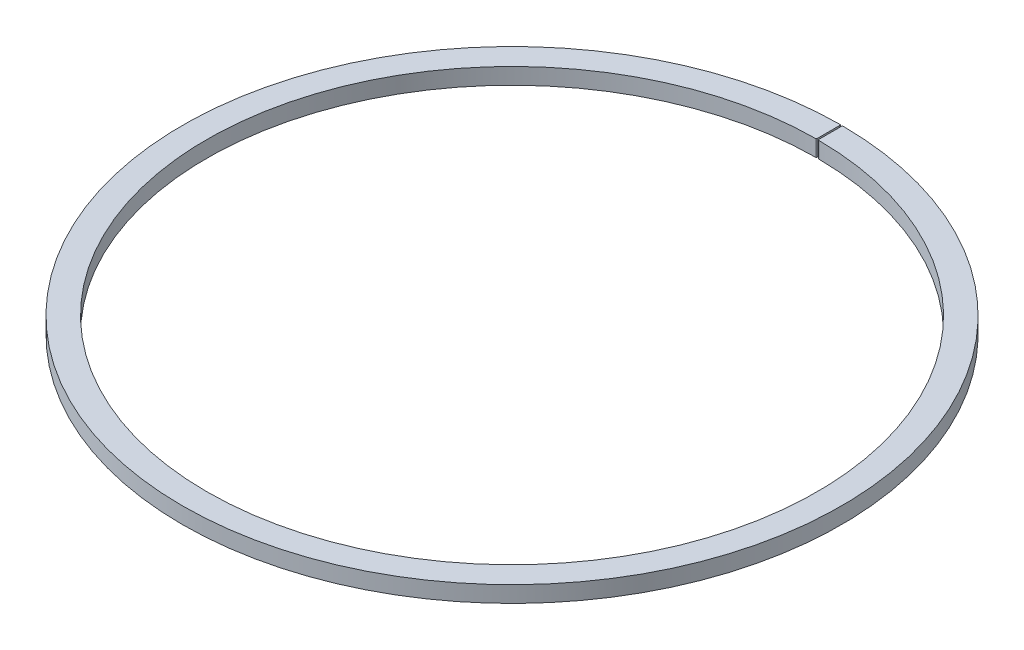
ISO-10303-21;
HEADER;
FILE_DESCRIPTION(('STEP AP214'),'2;1');
FILE_NAME('part.step','',(''),(''),'','','');
FILE_SCHEMA(('AUTOMOTIVE_DESIGN { 1 0 10303 214 1 1 1 1 }'));
ENDSEC;
DATA;
#1=APPLICATION_CONTEXT('core data for automotive mechanical design processes');
#2=APPLICATION_PROTOCOL_DEFINITION('international standard','automotive_design',2000,#1);
#3=PRODUCT_CONTEXT('',#1,'mechanical');
#4=PRODUCT('Part','Part','',(#3));
#5=PRODUCT_RELATED_PRODUCT_CATEGORY('part','',(#4));
#6=PRODUCT_DEFINITION_FORMATION('','',#4);
#7=PRODUCT_DEFINITION_CONTEXT('part definition',#1,'design');
#8=PRODUCT_DEFINITION('design','',#6,#7);
#9=PRODUCT_DEFINITION_SHAPE('','',#8);
#10=(LENGTH_UNIT() NAMED_UNIT(*) SI_UNIT(.MILLI.,.METRE.));
#11=(NAMED_UNIT(*) PLANE_ANGLE_UNIT() SI_UNIT($,.RADIAN.));
#12=(NAMED_UNIT(*) SI_UNIT($,.STERADIAN.) SOLID_ANGLE_UNIT());
#13=UNCERTAINTY_MEASURE_WITH_UNIT(LENGTH_MEASURE(1.E-05),#10,'distance_accuracy_value','');
#14=(GEOMETRIC_REPRESENTATION_CONTEXT(3) GLOBAL_UNCERTAINTY_ASSIGNED_CONTEXT((#13)) GLOBAL_UNIT_ASSIGNED_CONTEXT((#10,
#11,#12)) REPRESENTATION_CONTEXT('',''));
#15=CARTESIAN_POINT('',(0.,0.,0.));
#16=DIRECTION('',(0.,0.,1.));
#17=DIRECTION('',(1.,0.,0.));
#18=AXIS2_PLACEMENT_3D('',#15,#16,#17);
#19=CARTESIAN_POINT('',(-0.100000000000004,2.,0.));
#20=DIRECTION('',(1.,0.,0.));
#21=DIRECTION('',(0.,0.,-1.));
#22=AXIS2_PLACEMENT_3D('',#19,#20,#21);
#23=PLANE('',#22);
#24=DIRECTION('',(0.,0.,1.));
#25=VECTOR('',#24,1.);
#26=CARTESIAN_POINT('',(-0.100000000000004,2.,0.));
#27=LINE('',#26,#25);
#28=CARTESIAN_POINT('',(-0.0999999999999996,2.,-40.3995049474619));
#29=VERTEX_POINT('',#28);
#30=CARTESIAN_POINT('',(-0.0999999999999999,2.,-37.5994680813439));
#31=VERTEX_POINT('',#30);
#32=EDGE_CURVE('E135',#29,#31,#27,.T.);
#33=ORIENTED_EDGE('',*,*,#32,.T.);
#34=DIRECTION('',(0.,-1.,0.));
#35=VECTOR('',#34,1.);
#36=CARTESIAN_POINT('',(-0.0999999999999999,2.,-37.5994680813439));
#37=LINE('',#36,#35);
#38=CARTESIAN_POINT('',(-0.0999999999999999,0.,-37.5994680813439));
#39=VERTEX_POINT('',#38);
#40=EDGE_CURVE('E178',#31,#39,#37,.T.);
#41=ORIENTED_EDGE('',*,*,#40,.T.);
#42=DIRECTION('',(0.,0.,1.));
#43=VECTOR('',#42,1.);
#44=CARTESIAN_POINT('',(-0.100000000000004,0.,0.));
#45=LINE('',#44,#43);
#46=CARTESIAN_POINT('',(-0.0999999999999996,0.,-40.3995049474619));
#47=VERTEX_POINT('',#46);
#48=EDGE_CURVE('E117',#47,#39,#45,.T.);
#49=ORIENTED_EDGE('',*,*,#48,.F.);
#50=DIRECTION('',(0.,1.,0.));
#51=VECTOR('',#50,1.);
#52=CARTESIAN_POINT('',(-0.0999999999999996,2.,-40.3995049474619));
#53=LINE('',#52,#51);
#54=EDGE_CURVE('E175',#47,#29,#53,.T.);
#55=ORIENTED_EDGE('',*,*,#54,.T.);
#56=EDGE_LOOP('',(#33,#41,#49,#55));
#57=FACE_BOUND('',#56,.T.);
#58=ADVANCED_FACE('F46',(#57),#23,.T.);
#59=CARTESIAN_POINT('',(0.,2.,0.));
#60=DIRECTION('',(0.,-1.,0.));
#61=DIRECTION('',(0.,0.,-1.));
#62=AXIS2_PLACEMENT_3D('',#59,#60,#61);
#63=CYLINDRICAL_SURFACE('',#62,40.5);
#64=CARTESIAN_POINT('',(0.,0.,0.));
#65=DIRECTION('',(0.,1.,0.));
#66=DIRECTION('',(0.,0.,1.));
#67=AXIS2_PLACEMENT_3D('',#64,#65,#66);
#68=CIRCLE('',#67,40.5);
#69=CARTESIAN_POINT('',(-0.20049504950495,0.,-40.4995037220843));
#70=VERTEX_POINT('',#69);
#71=CARTESIAN_POINT('',(0.20049504950495,0.,-40.4995037220843));
#72=VERTEX_POINT('',#71);
#73=EDGE_CURVE('E185',#70,#72,#68,.T.);
#74=ORIENTED_EDGE('',*,*,#73,.T.);
#75=DIRECTION('',(0.,-1.,0.));
#76=VECTOR('',#75,1.);
#77=CARTESIAN_POINT('',(0.20049504950495,2.,-40.4995037220844));
#78=LINE('',#77,#76);
#79=CARTESIAN_POINT('',(0.20049504950495,2.,-40.4995037220843));
#80=VERTEX_POINT('',#79);
#81=EDGE_CURVE('E11',#72,#80,#78,.F.);
#82=ORIENTED_EDGE('',*,*,#81,.T.);
#83=CARTESIAN_POINT('',(0.,2.,0.));
#84=DIRECTION('',(0.,1.,0.));
#85=DIRECTION('',(0.,0.,1.));
#86=AXIS2_PLACEMENT_3D('',#83,#84,#85);
#87=CIRCLE('',#86,40.5);
#88=CARTESIAN_POINT('',(-0.20049504950495,2.,-40.4995037220843));
#89=VERTEX_POINT('',#88);
#90=EDGE_CURVE('E186',#89,#80,#87,.T.);
#91=ORIENTED_EDGE('',*,*,#90,.F.);
#92=DIRECTION('',(0.,-1.,0.));
#93=VECTOR('',#92,1.);
#94=CARTESIAN_POINT('',(-0.20049504950495,2.,-40.4995037220844));
#95=LINE('',#94,#93);
#96=EDGE_CURVE('E55',#89,#70,#95,.T.);
#97=ORIENTED_EDGE('',*,*,#96,.T.);
#98=EDGE_LOOP('',(#74,#82,#91,#97));
#99=FACE_BOUND('',#98,.T.);
#100=ADVANCED_FACE('F184',(#99),#63,.T.);
#101=CARTESIAN_POINT('',(0.100000000000004,2.,0.));
#102=DIRECTION('',(1.,0.,0.));
#103=DIRECTION('',(0.,0.,-1.));
#104=AXIS2_PLACEMENT_3D('',#101,#102,#103);
#105=PLANE('',#104);
#106=DIRECTION('',(0.,0.,1.));
#107=VECTOR('',#106,1.);
#108=CARTESIAN_POINT('',(0.100000000000004,0.,0.));
#109=LINE('',#108,#107);
#110=CARTESIAN_POINT('',(0.0999999999999996,0.,-40.3995049474619));
#111=VERTEX_POINT('',#110);
#112=CARTESIAN_POINT('',(0.0999999999999999,0.,-37.5994680813439));
#113=VERTEX_POINT('',#112);
#114=EDGE_CURVE('E136',#111,#113,#109,.T.);
#115=ORIENTED_EDGE('',*,*,#114,.T.);
#116=DIRECTION('',(0.,1.,0.));
#117=VECTOR('',#116,1.);
#118=CARTESIAN_POINT('',(0.0999999999999999,2.,-37.5994680813439));
#119=LINE('',#118,#117);
#120=CARTESIAN_POINT('',(0.0999999999999999,2.,-37.5994680813439));
#121=VERTEX_POINT('',#120);
#122=EDGE_CURVE('E162',#113,#121,#119,.T.);
#123=ORIENTED_EDGE('',*,*,#122,.T.);
#124=DIRECTION('',(0.,0.,1.));
#125=VECTOR('',#124,1.);
#126=CARTESIAN_POINT('',(0.100000000000004,2.,0.));
#127=LINE('',#126,#125);
#128=CARTESIAN_POINT('',(0.0999999999999996,2.,-40.3995049474619));
#129=VERTEX_POINT('',#128);
#130=EDGE_CURVE('E148',#129,#121,#127,.T.);
#131=ORIENTED_EDGE('',*,*,#130,.F.);
#132=DIRECTION('',(0.,-1.,0.));
#133=VECTOR('',#132,1.);
#134=CARTESIAN_POINT('',(0.0999999999999996,2.,-40.3995049474619));
#135=LINE('',#134,#133);
#136=EDGE_CURVE('E158',#129,#111,#135,.T.);
#137=ORIENTED_EDGE('',*,*,#136,.T.);
#138=EDGE_LOOP('',(#115,#123,#131,#137));
#139=FACE_BOUND('',#138,.T.);
#140=ADVANCED_FACE('F217',(#139),#105,.F.);
#141=CARTESIAN_POINT('',(0.,2.,0.));
#142=DIRECTION('',(0.,-1.,0.));
#143=DIRECTION('',(0.,0.,-1.));
#144=AXIS2_PLACEMENT_3D('',#141,#142,#143);
#145=CYLINDRICAL_SURFACE('',#144,37.5);
#146=CARTESIAN_POINT('',(0.,2.,0.));
#147=DIRECTION('',(0.,1.,0.));
#148=DIRECTION('',(0.,0.,1.));
#149=AXIS2_PLACEMENT_3D('',#146,#147,#148);
#150=CIRCLE('',#149,37.5);
#151=CARTESIAN_POINT('',(-0.199468085106383,2.,-37.4994694960212));
#152=VERTEX_POINT('',#151);
#153=CARTESIAN_POINT('',(0.199468085106383,2.,-37.4994694960212));
#154=VERTEX_POINT('',#153);
#155=EDGE_CURVE('E142',#152,#154,#150,.T.);
#156=ORIENTED_EDGE('',*,*,#155,.T.);
#157=DIRECTION('',(0.,-1.,0.));
#158=VECTOR('',#157,1.);
#159=CARTESIAN_POINT('',(0.199468085106383,2.,-37.4994694960212));
#160=LINE('',#159,#158);
#161=CARTESIAN_POINT('',(0.199468085106383,0.,-37.4994694960212));
#162=VERTEX_POINT('',#161);
#163=EDGE_CURVE('E133',#154,#162,#160,.T.);
#164=ORIENTED_EDGE('',*,*,#163,.T.);
#165=CARTESIAN_POINT('',(0.,0.,0.));
#166=DIRECTION('',(0.,1.,0.));
#167=DIRECTION('',(0.,0.,1.));
#168=AXIS2_PLACEMENT_3D('',#165,#166,#167);
#169=CIRCLE('',#168,37.5);
#170=CARTESIAN_POINT('',(-0.199468085106383,0.,-37.4994694960212));
#171=VERTEX_POINT('',#170);
#172=EDGE_CURVE('E115',#171,#162,#169,.T.);
#173=ORIENTED_EDGE('',*,*,#172,.F.);
#174=DIRECTION('',(0.,-1.,0.));
#175=VECTOR('',#174,1.);
#176=CARTESIAN_POINT('',(-0.199468085106383,2.,-37.4994694960212));
#177=LINE('',#176,#175);
#178=EDGE_CURVE('E130',#171,#152,#177,.F.);
#179=ORIENTED_EDGE('',*,*,#178,.T.);
#180=EDGE_LOOP('',(#156,#164,#173,#179));
#181=FACE_BOUND('',#180,.T.);
#182=ADVANCED_FACE('F129',(#181),#145,.F.);
#183=CARTESIAN_POINT('',(0.,2.,0.));
#184=DIRECTION('',(0.,1.,0.));
#185=DIRECTION('',(0.,0.,1.));
#186=AXIS2_PLACEMENT_3D('',#183,#184,#185);
#187=PLANE('',#186);
#188=ORIENTED_EDGE('',*,*,#130,.T.);
#189=CARTESIAN_POINT('',(0.2,2.,-37.5994680813439));
#190=DIRECTION('',(0.,1.,0.));
#191=DIRECTION('',(0.,0.,1.));
#192=AXIS2_PLACEMENT_3D('',#189,#190,#191);
#193=CIRCLE('',#192,0.1);
#194=EDGE_CURVE('E172',#121,#154,#193,.T.);
#195=ORIENTED_EDGE('',*,*,#194,.T.);
#196=ORIENTED_EDGE('',*,*,#155,.F.);
#197=CARTESIAN_POINT('',(-0.2,2.,-37.5994680813439));
#198=DIRECTION('',(0.,1.,0.));
#199=DIRECTION('',(0.,0.,1.));
#200=AXIS2_PLACEMENT_3D('',#197,#198,#199);
#201=CIRCLE('',#200,0.1);
#202=EDGE_CURVE('E140',#152,#31,#201,.T.);
#203=ORIENTED_EDGE('',*,*,#202,.T.);
#204=ORIENTED_EDGE('',*,*,#32,.F.);
#205=CARTESIAN_POINT('',(-0.2,2.,-40.3995049474619));
#206=DIRECTION('',(0.,1.,0.));
#207=DIRECTION('',(0.,0.,1.));
#208=AXIS2_PLACEMENT_3D('',#205,#206,#207);
#209=CIRCLE('',#208,0.1);
#210=EDGE_CURVE('E67',#29,#89,#209,.T.);
#211=ORIENTED_EDGE('',*,*,#210,.T.);
#212=ORIENTED_EDGE('',*,*,#90,.T.);
#213=CARTESIAN_POINT('',(0.2,2.,-40.3995049474619));
#214=DIRECTION('',(0.,1.,0.));
#215=DIRECTION('',(0.,0.,1.));
#216=AXIS2_PLACEMENT_3D('',#213,#214,#215);
#217=CIRCLE('',#216,0.1);
#218=EDGE_CURVE('E167',#80,#129,#217,.T.);
#219=ORIENTED_EDGE('',*,*,#218,.T.);
#220=EDGE_LOOP('',(#188,#195,#196,#203,#204,#211,#212,#219));
#221=FACE_BOUND('',#220,.T.);
#222=ADVANCED_FACE('F205',(#221),#187,.T.);
#223=CARTESIAN_POINT('',(0.,0.,0.));
#224=DIRECTION('',(0.,1.,0.));
#225=DIRECTION('',(0.,0.,1.));
#226=AXIS2_PLACEMENT_3D('',#223,#224,#225);
#227=PLANE('',#226);
#228=ORIENTED_EDGE('',*,*,#172,.T.);
#229=CARTESIAN_POINT('',(0.2,0.,-37.5994680813439));
#230=DIRECTION('',(0.,1.,0.));
#231=DIRECTION('',(0.,0.,1.));
#232=AXIS2_PLACEMENT_3D('',#229,#230,#231);
#233=CIRCLE('',#232,0.1);
#234=EDGE_CURVE('E123',#162,#113,#233,.F.);
#235=ORIENTED_EDGE('',*,*,#234,.T.);
#236=ORIENTED_EDGE('',*,*,#114,.F.);
#237=CARTESIAN_POINT('',(0.2,0.,-40.3995049474619));
#238=DIRECTION('',(0.,1.,0.));
#239=DIRECTION('',(0.,0.,1.));
#240=AXIS2_PLACEMENT_3D('',#237,#238,#239);
#241=CIRCLE('',#240,0.1);
#242=EDGE_CURVE('E124',#111,#72,#241,.F.);
#243=ORIENTED_EDGE('',*,*,#242,.T.);
#244=ORIENTED_EDGE('',*,*,#73,.F.);
#245=CARTESIAN_POINT('',(-0.2,0.,-40.3995049474619));
#246=DIRECTION('',(0.,1.,0.));
#247=DIRECTION('',(0.,0.,1.));
#248=AXIS2_PLACEMENT_3D('',#245,#246,#247);
#249=CIRCLE('',#248,0.1);
#250=EDGE_CURVE('E146',#70,#47,#249,.F.);
#251=ORIENTED_EDGE('',*,*,#250,.T.);
#252=ORIENTED_EDGE('',*,*,#48,.T.);
#253=CARTESIAN_POINT('',(-0.2,0.,-37.5994680813439));
#254=DIRECTION('',(0.,1.,0.));
#255=DIRECTION('',(0.,0.,1.));
#256=AXIS2_PLACEMENT_3D('',#253,#254,#255);
#257=CIRCLE('',#256,0.1);
#258=EDGE_CURVE('E112',#39,#171,#257,.F.);
#259=ORIENTED_EDGE('',*,*,#258,.T.);
#260=EDGE_LOOP('',(#228,#235,#236,#243,#244,#251,#252,#259));
#261=FACE_BOUND('',#260,.T.);
#262=ADVANCED_FACE('F114',(#261),#227,.F.);
#263=CARTESIAN_POINT('',(0.2,2.,-37.5994680813439));
#264=DIRECTION('',(0.,-1.,0.));
#265=DIRECTION('',(0.,0.,-1.));
#266=AXIS2_PLACEMENT_3D('',#263,#264,#265);
#267=CYLINDRICAL_SURFACE('',#266,0.1);
#268=ORIENTED_EDGE('',*,*,#194,.F.);
#269=ORIENTED_EDGE('',*,*,#122,.F.);
#270=ORIENTED_EDGE('',*,*,#234,.F.);
#271=ORIENTED_EDGE('',*,*,#163,.F.);
#272=EDGE_LOOP('',(#268,#269,#270,#271));
#273=FACE_BOUND('',#272,.T.);
#274=ADVANCED_FACE('F221',(#273),#267,.T.);
#275=CARTESIAN_POINT('',(-0.2,2.,-37.5994680813439));
#276=DIRECTION('',(0.,-1.,0.));
#277=DIRECTION('',(0.,0.,-1.));
#278=AXIS2_PLACEMENT_3D('',#275,#276,#277);
#279=CYLINDRICAL_SURFACE('',#278,0.1);
#280=ORIENTED_EDGE('',*,*,#202,.F.);
#281=ORIENTED_EDGE('',*,*,#178,.F.);
#282=ORIENTED_EDGE('',*,*,#258,.F.);
#283=ORIENTED_EDGE('',*,*,#40,.F.);
#284=EDGE_LOOP('',(#280,#281,#282,#283));
#285=FACE_BOUND('',#284,.T.);
#286=ADVANCED_FACE('F139',(#285),#279,.T.);
#287=CARTESIAN_POINT('',(0.2,2.,-40.3995049474619));
#288=DIRECTION('',(0.,-1.,0.));
#289=DIRECTION('',(0.,0.,-1.));
#290=AXIS2_PLACEMENT_3D('',#287,#288,#289);
#291=CYLINDRICAL_SURFACE('',#290,0.1);
#292=ORIENTED_EDGE('',*,*,#218,.F.);
#293=ORIENTED_EDGE('',*,*,#81,.F.);
#294=ORIENTED_EDGE('',*,*,#242,.F.);
#295=ORIENTED_EDGE('',*,*,#136,.F.);
#296=EDGE_LOOP('',(#292,#293,#294,#295));
#297=FACE_BOUND('',#296,.T.);
#298=ADVANCED_FACE('F207',(#297),#291,.T.);
#299=CARTESIAN_POINT('',(-0.2,2.,-40.3995049474619));
#300=DIRECTION('',(0.,-1.,0.));
#301=DIRECTION('',(0.,0.,-1.));
#302=AXIS2_PLACEMENT_3D('',#299,#300,#301);
#303=CYLINDRICAL_SURFACE('',#302,0.1);
#304=ORIENTED_EDGE('',*,*,#210,.F.);
#305=ORIENTED_EDGE('',*,*,#54,.F.);
#306=ORIENTED_EDGE('',*,*,#250,.F.);
#307=ORIENTED_EDGE('',*,*,#96,.F.);
#308=EDGE_LOOP('',(#304,#305,#306,#307));
#309=FACE_BOUND('',#308,.T.);
#310=ADVANCED_FACE('F48',(#309),#303,.T.);
#311=CLOSED_SHELL('',(#58,#100,#140,#182,#222,#262,#274,#286,#298,#310));
#312=MANIFOLD_SOLID_BREP('B2',#311);
#313=ADVANCED_BREP_SHAPE_REPRESENTATION('',(#18,#312),#14);
#314=SHAPE_DEFINITION_REPRESENTATION(#9,#313);
ENDSEC;
END-ISO-10303-21;
